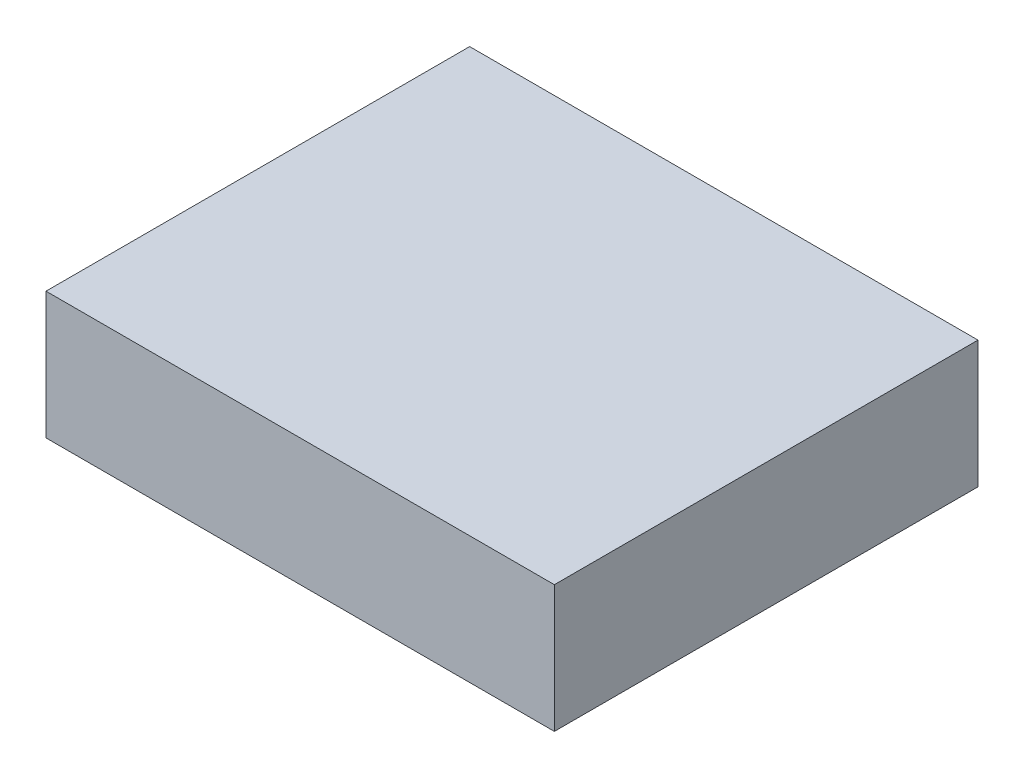
ISO-10303-21;
HEADER;
FILE_DESCRIPTION(('STEP AP214'),'2;1');
FILE_NAME('part.step','',(''),(''),'','','');
FILE_SCHEMA(('AUTOMOTIVE_DESIGN { 1 0 10303 214 1 1 1 1 }'));
ENDSEC;
DATA;
#1=APPLICATION_CONTEXT('core data for automotive mechanical design processes');
#2=APPLICATION_PROTOCOL_DEFINITION('international standard','automotive_design',2000,#1);
#3=PRODUCT_CONTEXT('',#1,'mechanical');
#4=PRODUCT('Part','Part','',(#3));
#5=PRODUCT_RELATED_PRODUCT_CATEGORY('part','',(#4));
#6=PRODUCT_DEFINITION_FORMATION('','',#4);
#7=PRODUCT_DEFINITION_CONTEXT('part definition',#1,'design');
#8=PRODUCT_DEFINITION('design','',#6,#7);
#9=PRODUCT_DEFINITION_SHAPE('','',#8);
#10=(LENGTH_UNIT() NAMED_UNIT(*) SI_UNIT(.MILLI.,.METRE.));
#11=(NAMED_UNIT(*) PLANE_ANGLE_UNIT() SI_UNIT($,.RADIAN.));
#12=(NAMED_UNIT(*) SI_UNIT($,.STERADIAN.) SOLID_ANGLE_UNIT());
#13=UNCERTAINTY_MEASURE_WITH_UNIT(LENGTH_MEASURE(1.E-05),#10,'distance_accuracy_value','');
#14=(GEOMETRIC_REPRESENTATION_CONTEXT(3) GLOBAL_UNCERTAINTY_ASSIGNED_CONTEXT((#13)) GLOBAL_UNIT_ASSIGNED_CONTEXT((#10,
#11,#12)) REPRESENTATION_CONTEXT('',''));
#15=CARTESIAN_POINT('',(0.,0.,0.));
#16=DIRECTION('',(0.,0.,1.));
#17=DIRECTION('',(1.,0.,0.));
#18=AXIS2_PLACEMENT_3D('',#15,#16,#17);
#19=CARTESIAN_POINT('',(0.,15.,0.));
#20=DIRECTION('',(1.,0.,0.));
#21=DIRECTION('',(0.,0.,-1.));
#22=AXIS2_PLACEMENT_3D('',#19,#20,#21);
#23=PLANE('',#22);
#24=DIRECTION('',(0.,0.,1.));
#25=VECTOR('',#24,1.);
#26=CARTESIAN_POINT('',(0.,0.,0.));
#27=LINE('',#26,#25);
#28=CARTESIAN_POINT('',(0.,0.,-50.));
#29=VERTEX_POINT('',#28);
#30=CARTESIAN_POINT('',(0.,0.,0.));
#31=VERTEX_POINT('',#30);
#32=EDGE_CURVE('E102',#29,#31,#27,.T.);
#33=ORIENTED_EDGE('',*,*,#32,.T.);
#34=DIRECTION('',(0.,-1.,0.));
#35=VECTOR('',#34,1.);
#36=CARTESIAN_POINT('',(0.,15.,0.));
#37=LINE('',#36,#35);
#38=CARTESIAN_POINT('',(0.,15.,0.));
#39=VERTEX_POINT('',#38);
#40=EDGE_CURVE('E11',#39,#31,#37,.T.);
#41=ORIENTED_EDGE('',*,*,#40,.F.);
#42=DIRECTION('',(0.,0.,1.));
#43=VECTOR('',#42,1.);
#44=CARTESIAN_POINT('',(0.,15.,0.));
#45=LINE('',#44,#43);
#46=CARTESIAN_POINT('',(0.,15.,-50.));
#47=VERTEX_POINT('',#46);
#48=EDGE_CURVE('E90',#47,#39,#45,.T.);
#49=ORIENTED_EDGE('',*,*,#48,.F.);
#50=DIRECTION('',(0.,-1.,0.));
#51=VECTOR('',#50,1.);
#52=CARTESIAN_POINT('',(0.,15.,-50.));
#53=LINE('',#52,#51);
#54=EDGE_CURVE('E98',#47,#29,#53,.T.);
#55=ORIENTED_EDGE('',*,*,#54,.T.);
#56=EDGE_LOOP('',(#33,#41,#49,#55));
#57=FACE_BOUND('',#56,.T.);
#58=ADVANCED_FACE('F39',(#57),#23,.F.);
#59=CARTESIAN_POINT('',(0.,15.,0.));
#60=DIRECTION('',(0.,0.,-1.));
#61=DIRECTION('',(-1.,0.,0.));
#62=AXIS2_PLACEMENT_3D('',#59,#60,#61);
#63=PLANE('',#62);
#64=DIRECTION('',(1.,0.,0.));
#65=VECTOR('',#64,1.);
#66=CARTESIAN_POINT('',(0.,0.,0.));
#67=LINE('',#66,#65);
#68=CARTESIAN_POINT('',(60.,0.,0.));
#69=VERTEX_POINT('',#68);
#70=EDGE_CURVE('E94',#31,#69,#67,.T.);
#71=ORIENTED_EDGE('',*,*,#70,.T.);
#72=DIRECTION('',(0.,-1.,0.));
#73=VECTOR('',#72,1.);
#74=CARTESIAN_POINT('',(60.,15.,0.));
#75=LINE('',#74,#73);
#76=CARTESIAN_POINT('',(60.,15.,0.));
#77=VERTEX_POINT('',#76);
#78=EDGE_CURVE('E47',#77,#69,#75,.T.);
#79=ORIENTED_EDGE('',*,*,#78,.F.);
#80=DIRECTION('',(1.,0.,0.));
#81=VECTOR('',#80,1.);
#82=CARTESIAN_POINT('',(0.,15.,0.));
#83=LINE('',#82,#81);
#84=EDGE_CURVE('E85',#39,#77,#83,.T.);
#85=ORIENTED_EDGE('',*,*,#84,.F.);
#86=ORIENTED_EDGE('',*,*,#40,.T.);
#87=EDGE_LOOP('',(#71,#79,#85,#86));
#88=FACE_BOUND('',#87,.T.);
#89=ADVANCED_FACE('F93',(#88),#63,.F.);
#90=CARTESIAN_POINT('',(60.,15.,0.));
#91=DIRECTION('',(-1.,0.,0.));
#92=DIRECTION('',(0.,0.,1.));
#93=AXIS2_PLACEMENT_3D('',#90,#91,#92);
#94=PLANE('',#93);
#95=DIRECTION('',(0.,0.,-1.));
#96=VECTOR('',#95,1.);
#97=CARTESIAN_POINT('',(60.,0.,0.));
#98=LINE('',#97,#96);
#99=CARTESIAN_POINT('',(60.,0.,-50.));
#100=VERTEX_POINT('',#99);
#101=EDGE_CURVE('E72',#69,#100,#98,.T.);
#102=ORIENTED_EDGE('',*,*,#101,.T.);
#103=DIRECTION('',(0.,-1.,0.));
#104=VECTOR('',#103,1.);
#105=CARTESIAN_POINT('',(60.,15.,-50.));
#106=LINE('',#105,#104);
#107=CARTESIAN_POINT('',(60.,15.,-50.));
#108=VERTEX_POINT('',#107);
#109=EDGE_CURVE('E95',#108,#100,#106,.T.);
#110=ORIENTED_EDGE('',*,*,#109,.F.);
#111=DIRECTION('',(0.,0.,-1.));
#112=VECTOR('',#111,1.);
#113=CARTESIAN_POINT('',(60.,15.,0.));
#114=LINE('',#113,#112);
#115=EDGE_CURVE('E88',#77,#108,#114,.T.);
#116=ORIENTED_EDGE('',*,*,#115,.F.);
#117=ORIENTED_EDGE('',*,*,#78,.T.);
#118=EDGE_LOOP('',(#102,#110,#116,#117));
#119=FACE_BOUND('',#118,.T.);
#120=ADVANCED_FACE('F96',(#119),#94,.F.);
#121=CARTESIAN_POINT('',(0.,15.,-50.));
#122=DIRECTION('',(0.,0.,1.));
#123=DIRECTION('',(1.,0.,0.));
#124=AXIS2_PLACEMENT_3D('',#121,#122,#123);
#125=PLANE('',#124);
#126=DIRECTION('',(-1.,0.,0.));
#127=VECTOR('',#126,1.);
#128=CARTESIAN_POINT('',(0.,0.,-50.));
#129=LINE('',#128,#127);
#130=EDGE_CURVE('E78',#100,#29,#129,.T.);
#131=ORIENTED_EDGE('',*,*,#130,.T.);
#132=ORIENTED_EDGE('',*,*,#54,.F.);
#133=DIRECTION('',(-1.,0.,0.));
#134=VECTOR('',#133,1.);
#135=CARTESIAN_POINT('',(0.,15.,-50.));
#136=LINE('',#135,#134);
#137=EDGE_CURVE('E55',#108,#47,#136,.T.);
#138=ORIENTED_EDGE('',*,*,#137,.F.);
#139=ORIENTED_EDGE('',*,*,#109,.T.);
#140=EDGE_LOOP('',(#131,#132,#138,#139));
#141=FACE_BOUND('',#140,.T.);
#142=ADVANCED_FACE('F109',(#141),#125,.F.);
#143=CARTESIAN_POINT('',(0.,15.,0.));
#144=DIRECTION('',(0.,-1.,0.));
#145=DIRECTION('',(0.,0.,-1.));
#146=AXIS2_PLACEMENT_3D('',#143,#144,#145);
#147=PLANE('',#146);
#148=ORIENTED_EDGE('',*,*,#48,.T.);
#149=ORIENTED_EDGE('',*,*,#84,.T.);
#150=ORIENTED_EDGE('',*,*,#115,.T.);
#151=ORIENTED_EDGE('',*,*,#137,.T.);
#152=EDGE_LOOP('',(#148,#149,#150,#151));
#153=FACE_BOUND('',#152,.T.);
#154=ADVANCED_FACE('F86',(#153),#147,.F.);
#155=CARTESIAN_POINT('',(0.,0.,0.));
#156=DIRECTION('',(0.,-1.,0.));
#157=DIRECTION('',(0.,0.,-1.));
#158=AXIS2_PLACEMENT_3D('',#155,#156,#157);
#159=PLANE('',#158);
#160=ORIENTED_EDGE('',*,*,#32,.F.);
#161=ORIENTED_EDGE('',*,*,#130,.F.);
#162=ORIENTED_EDGE('',*,*,#101,.F.);
#163=ORIENTED_EDGE('',*,*,#70,.F.);
#164=EDGE_LOOP('',(#160,#161,#162,#163));
#165=FACE_BOUND('',#164,.T.);
#166=ADVANCED_FACE('F112',(#165),#159,.T.);
#167=CLOSED_SHELL('',(#58,#89,#120,#142,#154,#166));
#168=MANIFOLD_SOLID_BREP('B2',#167);
#169=ADVANCED_BREP_SHAPE_REPRESENTATION('',(#18,#168),#14);
#170=SHAPE_DEFINITION_REPRESENTATION(#9,#169);
ENDSEC;
END-ISO-10303-21;
